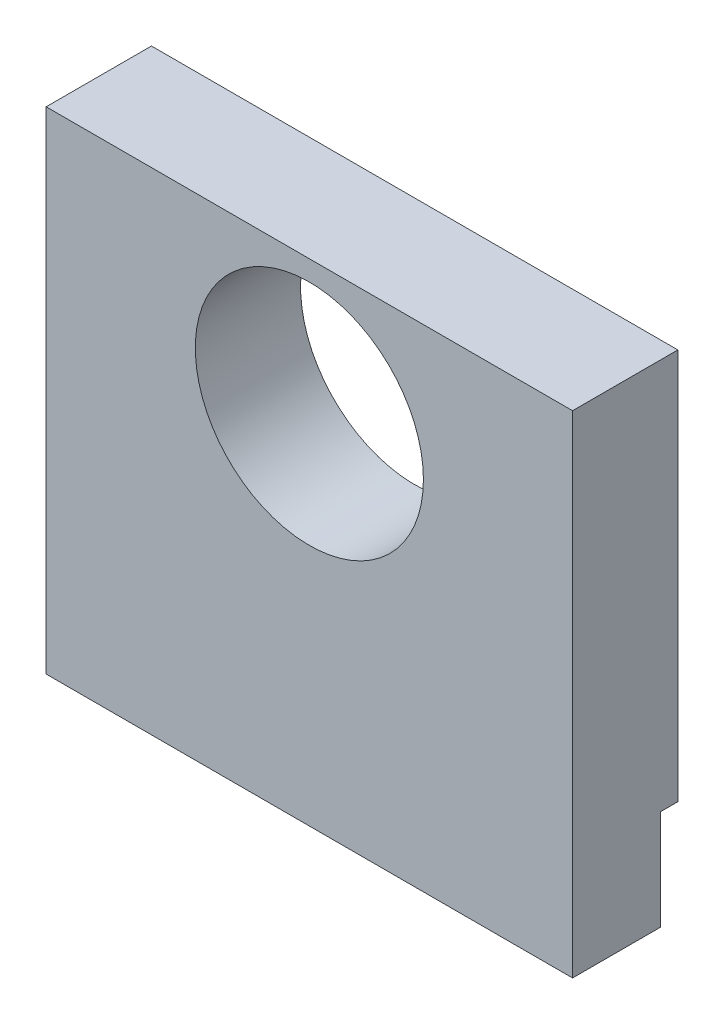
ISO-10303-21;
HEADER;
FILE_DESCRIPTION(('STEP AP214'),'2;1');
FILE_NAME('part.step','',(''),(''),'','','');
FILE_SCHEMA(('AUTOMOTIVE_DESIGN { 1 0 10303 214 1 1 1 1 }'));
ENDSEC;
DATA;
#1=APPLICATION_CONTEXT('core data for automotive mechanical design processes');
#2=APPLICATION_PROTOCOL_DEFINITION('international standard','automotive_design',2000,#1);
#3=PRODUCT_CONTEXT('',#1,'mechanical');
#4=PRODUCT('Part','Part','',(#3));
#5=PRODUCT_RELATED_PRODUCT_CATEGORY('part','',(#4));
#6=PRODUCT_DEFINITION_FORMATION('','',#4);
#7=PRODUCT_DEFINITION_CONTEXT('part definition',#1,'design');
#8=PRODUCT_DEFINITION('design','',#6,#7);
#9=PRODUCT_DEFINITION_SHAPE('','',#8);
#10=(LENGTH_UNIT() NAMED_UNIT(*) SI_UNIT(.MILLI.,.METRE.));
#11=(NAMED_UNIT(*) PLANE_ANGLE_UNIT() SI_UNIT($,.RADIAN.));
#12=(NAMED_UNIT(*) SI_UNIT($,.STERADIAN.) SOLID_ANGLE_UNIT());
#13=UNCERTAINTY_MEASURE_WITH_UNIT(LENGTH_MEASURE(1.E-05),#10,'distance_accuracy_value','');
#14=(GEOMETRIC_REPRESENTATION_CONTEXT(3) GLOBAL_UNCERTAINTY_ASSIGNED_CONTEXT((#13)) GLOBAL_UNIT_ASSIGNED_CONTEXT((#10,
#11,#12)) REPRESENTATION_CONTEXT('',''));
#15=CARTESIAN_POINT('',(0.,0.,0.));
#16=DIRECTION('',(0.,0.,1.));
#17=DIRECTION('',(1.,0.,0.));
#18=AXIS2_PLACEMENT_3D('',#15,#16,#17);
#19=CARTESIAN_POINT('',(43.6356421265527,2.7,137.));
#20=DIRECTION('',(0.,0.,1.));
#21=DIRECTION('',(1.,0.,0.));
#22=AXIS2_PLACEMENT_3D('',#19,#20,#21);
#23=PLANE('',#22);
#24=CARTESIAN_POINT('',(0.,17.35,137.));
#25=DIRECTION('',(0.,0.,1.));
#26=DIRECTION('',(1.,0.,0.));
#27=AXIS2_PLACEMENT_3D('',#24,#25,#26);
#28=CIRCLE('',#27,6.5);
#29=CARTESIAN_POINT('',(6.5,17.35,137.));
#30=VERTEX_POINT('',#29);
#31=EDGE_CURVE('E111',#30,#30,#28,.F.);
#32=ORIENTED_EDGE('',*,*,#31,.F.);
#33=EDGE_LOOP('',(#32));
#34=FACE_BOUND('',#33,.T.);
#35=DIRECTION('',(-1.,0.,0.));
#36=VECTOR('',#35,1.);
#37=CARTESIAN_POINT('',(43.6356421265527,25.,137.));
#38=LINE('',#37,#36);
#39=CARTESIAN_POINT('',(15.,25.,137.));
#40=VERTEX_POINT('',#39);
#41=CARTESIAN_POINT('',(-15.,25.,137.));
#42=VERTEX_POINT('',#41);
#43=EDGE_CURVE('E88',#40,#42,#38,.T.);
#44=ORIENTED_EDGE('',*,*,#43,.F.);
#45=DIRECTION('',(0.,-1.,0.));
#46=VECTOR('',#45,1.);
#47=CARTESIAN_POINT('',(15.,2.7,137.));
#48=LINE('',#47,#46);
#49=CARTESIAN_POINT('',(15.,2.7,137.));
#50=VERTEX_POINT('',#49);
#51=EDGE_CURVE('E46',#40,#50,#48,.T.);
#52=ORIENTED_EDGE('',*,*,#51,.T.);
#53=DIRECTION('',(-1.,0.,0.));
#54=VECTOR('',#53,1.);
#55=CARTESIAN_POINT('',(43.6356421265527,2.7,137.));
#56=LINE('',#55,#54);
#57=CARTESIAN_POINT('',(-15.,2.7,137.));
#58=VERTEX_POINT('',#57);
#59=EDGE_CURVE('E110',#50,#58,#56,.T.);
#60=ORIENTED_EDGE('',*,*,#59,.T.);
#61=DIRECTION('',(0.,1.,0.));
#62=VECTOR('',#61,1.);
#63=CARTESIAN_POINT('',(-15.,2.7,137.));
#64=LINE('',#63,#62);
#65=EDGE_CURVE('E103',#58,#42,#64,.T.);
#66=ORIENTED_EDGE('',*,*,#65,.T.);
#67=EDGE_LOOP('',(#44,#52,#60,#66));
#68=FACE_BOUND('',#67,.T.);
#69=ADVANCED_FACE('F39',(#34,#68),#23,.F.);
#70=CARTESIAN_POINT('',(43.6356421265527,25.,137.));
#71=DIRECTION('',(0.,-1.,0.));
#72=DIRECTION('',(0.,0.,-1.));
#73=AXIS2_PLACEMENT_3D('',#70,#71,#72);
#74=PLANE('',#73);
#75=DIRECTION('',(-1.,0.,0.));
#76=VECTOR('',#75,1.);
#77=CARTESIAN_POINT('',(43.6356421265527,25.,143.));
#78=LINE('',#77,#76);
#79=CARTESIAN_POINT('',(15.,25.,143.));
#80=VERTEX_POINT('',#79);
#81=CARTESIAN_POINT('',(-15.,25.,143.));
#82=VERTEX_POINT('',#81);
#83=EDGE_CURVE('E98',#80,#82,#78,.T.);
#84=ORIENTED_EDGE('',*,*,#83,.F.);
#85=DIRECTION('',(0.,0.,-1.));
#86=VECTOR('',#85,1.);
#87=CARTESIAN_POINT('',(15.,25.,137.));
#88=LINE('',#87,#86);
#89=EDGE_CURVE('E53',#80,#40,#88,.T.);
#90=ORIENTED_EDGE('',*,*,#89,.T.);
#91=ORIENTED_EDGE('',*,*,#43,.T.);
#92=DIRECTION('',(0.,0.,1.));
#93=VECTOR('',#92,1.);
#94=CARTESIAN_POINT('',(-15.,25.,137.));
#95=LINE('',#94,#93);
#96=EDGE_CURVE('E92',#42,#82,#95,.T.);
#97=ORIENTED_EDGE('',*,*,#96,.T.);
#98=EDGE_LOOP('',(#84,#90,#91,#97));
#99=FACE_BOUND('',#98,.T.);
#100=ADVANCED_FACE('F91',(#99),#74,.F.);
#101=CARTESIAN_POINT('',(43.6356421265527,25.,143.));
#102=DIRECTION('',(0.,0.,-1.));
#103=DIRECTION('',(-1.,0.,0.));
#104=AXIS2_PLACEMENT_3D('',#101,#102,#103);
#105=PLANE('',#104);
#106=CARTESIAN_POINT('',(0.,17.35,143.));
#107=DIRECTION('',(0.,0.,1.));
#108=DIRECTION('',(1.,0.,0.));
#109=AXIS2_PLACEMENT_3D('',#106,#107,#108);
#110=CIRCLE('',#109,6.5);
#111=CARTESIAN_POINT('',(6.5,17.35,143.));
#112=VERTEX_POINT('',#111);
#113=EDGE_CURVE('E114',#112,#112,#110,.T.);
#114=ORIENTED_EDGE('',*,*,#113,.F.);
#115=EDGE_LOOP('',(#114));
#116=FACE_BOUND('',#115,.T.);
#117=DIRECTION('',(-1.,0.,0.));
#118=VECTOR('',#117,1.);
#119=CARTESIAN_POINT('',(43.6356421265527,-3.,143.));
#120=LINE('',#119,#118);
#121=CARTESIAN_POINT('',(15.,-3.,143.));
#122=VERTEX_POINT('',#121);
#123=CARTESIAN_POINT('',(-15.,-3.,143.));
#124=VERTEX_POINT('',#123);
#125=EDGE_CURVE('E133',#122,#124,#120,.T.);
#126=ORIENTED_EDGE('',*,*,#125,.F.);
#127=DIRECTION('',(0.,1.,0.));
#128=VECTOR('',#127,1.);
#129=CARTESIAN_POINT('',(15.,25.,143.));
#130=LINE('',#129,#128);
#131=EDGE_CURVE('E57',#122,#80,#130,.T.);
#132=ORIENTED_EDGE('',*,*,#131,.T.);
#133=ORIENTED_EDGE('',*,*,#83,.T.);
#134=DIRECTION('',(0.,-1.,0.));
#135=VECTOR('',#134,1.);
#136=CARTESIAN_POINT('',(-15.,25.,143.));
#137=LINE('',#136,#135);
#138=EDGE_CURVE('E107',#82,#124,#137,.T.);
#139=ORIENTED_EDGE('',*,*,#138,.T.);
#140=EDGE_LOOP('',(#126,#132,#133,#139));
#141=FACE_BOUND('',#140,.T.);
#142=ADVANCED_FACE('F137',(#116,#141),#105,.F.);
#143=CARTESIAN_POINT('',(43.6356421265527,-3.,143.));
#144=DIRECTION('',(0.,1.,0.));
#145=DIRECTION('',(0.,0.,1.));
#146=AXIS2_PLACEMENT_3D('',#143,#144,#145);
#147=PLANE('',#146);
#148=DIRECTION('',(-1.,0.,0.));
#149=VECTOR('',#148,1.);
#150=CARTESIAN_POINT('',(43.6356421265527,-3.,138.));
#151=LINE('',#150,#149);
#152=CARTESIAN_POINT('',(15.,-3.,138.));
#153=VERTEX_POINT('',#152);
#154=CARTESIAN_POINT('',(-15.,-3.,138.));
#155=VERTEX_POINT('',#154);
#156=EDGE_CURVE('E131',#153,#155,#151,.T.);
#157=ORIENTED_EDGE('',*,*,#156,.F.);
#158=DIRECTION('',(0.,0.,1.));
#159=VECTOR('',#158,1.);
#160=CARTESIAN_POINT('',(15.,-3.,143.));
#161=LINE('',#160,#159);
#162=EDGE_CURVE('E138',#153,#122,#161,.T.);
#163=ORIENTED_EDGE('',*,*,#162,.T.);
#164=ORIENTED_EDGE('',*,*,#125,.T.);
#165=DIRECTION('',(0.,0.,-1.));
#166=VECTOR('',#165,1.);
#167=CARTESIAN_POINT('',(-15.,-3.,143.));
#168=LINE('',#167,#166);
#169=EDGE_CURVE('E120',#124,#155,#168,.T.);
#170=ORIENTED_EDGE('',*,*,#169,.T.);
#171=EDGE_LOOP('',(#157,#163,#164,#170));
#172=FACE_BOUND('',#171,.T.);
#173=ADVANCED_FACE('F149',(#172),#147,.F.);
#174=CARTESIAN_POINT('',(43.6356421265527,2.7,138.));
#175=DIRECTION('',(0.,0.,-1.));
#176=DIRECTION('',(-1.,0.,0.));
#177=AXIS2_PLACEMENT_3D('',#174,#175,#176);
#178=PLANE('',#177);
#179=DIRECTION('',(0.,1.,0.));
#180=VECTOR('',#179,1.);
#181=CARTESIAN_POINT('',(15.,2.7,138.));
#182=LINE('',#181,#180);
#183=CARTESIAN_POINT('',(15.,2.7,138.));
#184=VERTEX_POINT('',#183);
#185=EDGE_CURVE('E97',#153,#184,#182,.T.);
#186=ORIENTED_EDGE('',*,*,#185,.F.);
#187=ORIENTED_EDGE('',*,*,#156,.T.);
#188=DIRECTION('',(0.,-1.,0.));
#189=VECTOR('',#188,1.);
#190=CARTESIAN_POINT('',(-15.,2.7,138.));
#191=LINE('',#190,#189);
#192=CARTESIAN_POINT('',(-15.,2.7,138.));
#193=VERTEX_POINT('',#192);
#194=EDGE_CURVE('E123',#193,#155,#191,.T.);
#195=ORIENTED_EDGE('',*,*,#194,.F.);
#196=DIRECTION('',(-1.,0.,0.));
#197=VECTOR('',#196,1.);
#198=CARTESIAN_POINT('',(43.6356421265527,2.7,138.));
#199=LINE('',#198,#197);
#200=EDGE_CURVE('E129',#184,#193,#199,.T.);
#201=ORIENTED_EDGE('',*,*,#200,.F.);
#202=EDGE_LOOP('',(#186,#187,#195,#201));
#203=FACE_BOUND('',#202,.T.);
#204=ADVANCED_FACE('F156',(#203),#178,.T.);
#205=CARTESIAN_POINT('',(43.6356421265527,2.7,137.));
#206=DIRECTION('',(0.,-1.,0.));
#207=DIRECTION('',(0.,0.,-1.));
#208=AXIS2_PLACEMENT_3D('',#205,#206,#207);
#209=PLANE('',#208);
#210=DIRECTION('',(0.,0.,-1.));
#211=VECTOR('',#210,1.);
#212=CARTESIAN_POINT('',(15.,2.7,137.));
#213=LINE('',#212,#211);
#214=EDGE_CURVE('E11',#184,#50,#213,.T.);
#215=ORIENTED_EDGE('',*,*,#214,.F.);
#216=ORIENTED_EDGE('',*,*,#200,.T.);
#217=DIRECTION('',(0.,0.,1.));
#218=VECTOR('',#217,1.);
#219=CARTESIAN_POINT('',(-15.,2.7,137.));
#220=LINE('',#219,#218);
#221=EDGE_CURVE('E126',#58,#193,#220,.T.);
#222=ORIENTED_EDGE('',*,*,#221,.F.);
#223=ORIENTED_EDGE('',*,*,#59,.F.);
#224=EDGE_LOOP('',(#215,#216,#222,#223));
#225=FACE_BOUND('',#224,.T.);
#226=ADVANCED_FACE('F174',(#225),#209,.T.);
#227=CARTESIAN_POINT('',(-15.,0.,0.));
#228=DIRECTION('',(1.,0.,0.));
#229=DIRECTION('',(0.,0.,-1.));
#230=AXIS2_PLACEMENT_3D('',#227,#228,#229);
#231=PLANE('',#230);
#232=ORIENTED_EDGE('',*,*,#65,.F.);
#233=ORIENTED_EDGE('',*,*,#221,.T.);
#234=ORIENTED_EDGE('',*,*,#194,.T.);
#235=ORIENTED_EDGE('',*,*,#169,.F.);
#236=ORIENTED_EDGE('',*,*,#138,.F.);
#237=ORIENTED_EDGE('',*,*,#96,.F.);
#238=EDGE_LOOP('',(#232,#233,#234,#235,#236,#237));
#239=FACE_BOUND('',#238,.T.);
#240=ADVANCED_FACE('F101',(#239),#231,.F.);
#241=CARTESIAN_POINT('',(15.,-3.,138.));
#242=DIRECTION('',(-1.,0.,0.));
#243=DIRECTION('',(0.,0.,1.));
#244=AXIS2_PLACEMENT_3D('',#241,#242,#243);
#245=PLANE('',#244);
#246=ORIENTED_EDGE('',*,*,#89,.F.);
#247=ORIENTED_EDGE('',*,*,#131,.F.);
#248=ORIENTED_EDGE('',*,*,#162,.F.);
#249=ORIENTED_EDGE('',*,*,#185,.T.);
#250=ORIENTED_EDGE('',*,*,#214,.T.);
#251=ORIENTED_EDGE('',*,*,#51,.F.);
#252=EDGE_LOOP('',(#246,#247,#248,#249,#250,#251));
#253=FACE_BOUND('',#252,.T.);
#254=ADVANCED_FACE('F166',(#253),#245,.F.);
#255=CARTESIAN_POINT('',(0.,17.35,118.61522368915));
#256=DIRECTION('',(0.,0.,1.));
#257=DIRECTION('',(1.,0.,0.));
#258=AXIS2_PLACEMENT_3D('',#255,#256,#257);
#259=CYLINDRICAL_SURFACE('',#258,6.5);
#260=ORIENTED_EDGE('',*,*,#31,.T.);
#261=EDGE_LOOP('',(#260));
#262=FACE_BOUND('',#261,.T.);
#263=ORIENTED_EDGE('',*,*,#113,.T.);
#264=EDGE_LOOP('',(#263));
#265=FACE_BOUND('',#264,.T.);
#266=ADVANCED_FACE('F146',(#262,#265),#259,.F.);
#267=CLOSED_SHELL('',(#69,#100,#142,#173,#204,#226,#240,#254,#266));
#268=MANIFOLD_SOLID_BREP('B2',#267);
#269=ADVANCED_BREP_SHAPE_REPRESENTATION('',(#18,#268),#14);
#270=SHAPE_DEFINITION_REPRESENTATION(#9,#269);
ENDSEC;
END-ISO-10303-21;
